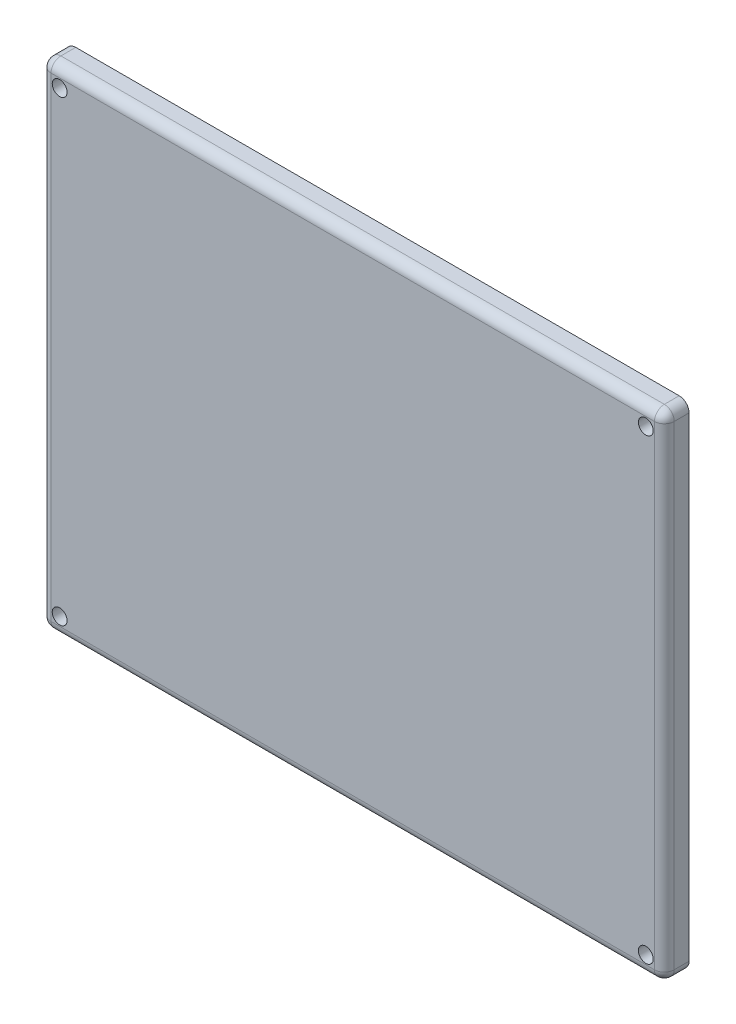
ISO-10303-21;
HEADER;
FILE_DESCRIPTION(('STEP AP214'),'2;1');
FILE_NAME('part.step','',(''),(''),'','','');
FILE_SCHEMA(('AUTOMOTIVE_DESIGN { 1 0 10303 214 1 1 1 1 }'));
ENDSEC;
DATA;
#1=APPLICATION_CONTEXT('core data for automotive mechanical design processes');
#2=APPLICATION_PROTOCOL_DEFINITION('international standard','automotive_design',2000,#1);
#3=PRODUCT_CONTEXT('',#1,'mechanical');
#4=PRODUCT('Part','Part','',(#3));
#5=PRODUCT_RELATED_PRODUCT_CATEGORY('part','',(#4));
#6=PRODUCT_DEFINITION_FORMATION('','',#4);
#7=PRODUCT_DEFINITION_CONTEXT('part definition',#1,'design');
#8=PRODUCT_DEFINITION('design','',#6,#7);
#9=PRODUCT_DEFINITION_SHAPE('','',#8);
#10=(LENGTH_UNIT() NAMED_UNIT(*) SI_UNIT(.MILLI.,.METRE.));
#11=(NAMED_UNIT(*) PLANE_ANGLE_UNIT() SI_UNIT($,.RADIAN.));
#12=(NAMED_UNIT(*) SI_UNIT($,.STERADIAN.) SOLID_ANGLE_UNIT());
#13=UNCERTAINTY_MEASURE_WITH_UNIT(LENGTH_MEASURE(1.E-05),#10,'distance_accuracy_value','');
#14=(GEOMETRIC_REPRESENTATION_CONTEXT(3) GLOBAL_UNCERTAINTY_ASSIGNED_CONTEXT((#13)) GLOBAL_UNIT_ASSIGNED_CONTEXT((#10,
#11,#12)) REPRESENTATION_CONTEXT('',''));
#15=CARTESIAN_POINT('',(0.,0.,0.));
#16=DIRECTION('',(0.,0.,1.));
#17=DIRECTION('',(1.,0.,0.));
#18=AXIS2_PLACEMENT_3D('',#15,#16,#17);
#19=CARTESIAN_POINT('',(0.,0.,6.35));
#20=DIRECTION('',(1.,0.,0.));
#21=DIRECTION('',(0.,1.,0.));
#22=AXIS2_PLACEMENT_3D('',#19,#20,#21);
#23=PLANE('',#22);
#24=DIRECTION('',(0.,-1.,0.));
#25=VECTOR('',#24,1.);
#26=CARTESIAN_POINT('',(0.,0.,0.));
#27=LINE('',#26,#25);
#28=CARTESIAN_POINT('',(0.,-2.54,0.));
#29=VERTEX_POINT('',#28);
#30=CARTESIAN_POINT('',(0.,-124.46,0.));
#31=VERTEX_POINT('',#30);
#32=EDGE_CURVE('E294',#29,#31,#27,.T.);
#33=ORIENTED_EDGE('',*,*,#32,.T.);
#34=DIRECTION('',(0.,0.,-1.));
#35=VECTOR('',#34,1.);
#36=CARTESIAN_POINT('',(0.,-124.46,6.35));
#37=LINE('',#36,#35);
#38=CARTESIAN_POINT('',(0.,-124.46,3.81));
#39=VERTEX_POINT('',#38);
#40=EDGE_CURVE('E245',#31,#39,#37,.F.);
#41=ORIENTED_EDGE('',*,*,#40,.T.);
#42=DIRECTION('',(0.,-1.,0.));
#43=VECTOR('',#42,1.);
#44=CARTESIAN_POINT('',(0.,0.,3.81));
#45=LINE('',#44,#43);
#46=CARTESIAN_POINT('',(0.,-2.54,3.81));
#47=VERTEX_POINT('',#46);
#48=EDGE_CURVE('E242',#39,#47,#45,.F.);
#49=ORIENTED_EDGE('',*,*,#48,.T.);
#50=DIRECTION('',(0.,0.,-1.));
#51=VECTOR('',#50,1.);
#52=CARTESIAN_POINT('',(0.,-2.54,6.35));
#53=LINE('',#52,#51);
#54=EDGE_CURVE('E239',#47,#29,#53,.T.);
#55=ORIENTED_EDGE('',*,*,#54,.T.);
#56=EDGE_LOOP('',(#33,#41,#49,#55));
#57=FACE_BOUND('',#56,.T.);
#58=ADVANCED_FACE('F41',(#57),#23,.F.);
#59=CARTESIAN_POINT('',(0.,-127.,6.35));
#60=DIRECTION('',(0.,1.,0.));
#61=DIRECTION('',(0.,0.,1.));
#62=AXIS2_PLACEMENT_3D('',#59,#60,#61);
#63=PLANE('',#62);
#64=DIRECTION('',(1.,0.,0.));
#65=VECTOR('',#64,1.);
#66=CARTESIAN_POINT('',(0.,-127.,3.81));
#67=LINE('',#66,#65);
#68=CARTESIAN_POINT('',(157.48,-127.,3.81));
#69=VERTEX_POINT('',#68);
#70=CARTESIAN_POINT('',(2.54000000000002,-127.,3.81));
#71=VERTEX_POINT('',#70);
#72=EDGE_CURVE('E233',#69,#71,#67,.F.);
#73=ORIENTED_EDGE('',*,*,#72,.T.);
#74=DIRECTION('',(0.,0.,-1.));
#75=VECTOR('',#74,1.);
#76=CARTESIAN_POINT('',(2.54000000000002,-127.,6.35));
#77=LINE('',#76,#75);
#78=CARTESIAN_POINT('',(2.54000000000002,-127.,0.));
#79=VERTEX_POINT('',#78);
#80=EDGE_CURVE('E236',#71,#79,#77,.T.);
#81=ORIENTED_EDGE('',*,*,#80,.T.);
#82=DIRECTION('',(1.,0.,0.));
#83=VECTOR('',#82,1.);
#84=CARTESIAN_POINT('',(0.,-127.,0.));
#85=LINE('',#84,#83);
#86=CARTESIAN_POINT('',(157.48,-127.,0.));
#87=VERTEX_POINT('',#86);
#88=EDGE_CURVE('E387',#79,#87,#85,.T.);
#89=ORIENTED_EDGE('',*,*,#88,.T.);
#90=DIRECTION('',(0.,0.,-1.));
#91=VECTOR('',#90,1.);
#92=CARTESIAN_POINT('',(157.48,-127.,6.35));
#93=LINE('',#92,#91);
#94=EDGE_CURVE('E230',#87,#69,#93,.F.);
#95=ORIENTED_EDGE('',*,*,#94,.T.);
#96=EDGE_LOOP('',(#73,#81,#89,#95));
#97=FACE_BOUND('',#96,.T.);
#98=ADVANCED_FACE('F447',(#97),#63,.F.);
#99=CARTESIAN_POINT('',(160.02,0.,6.35));
#100=DIRECTION('',(-1.,0.,0.));
#101=DIRECTION('',(0.,-1.,0.));
#102=AXIS2_PLACEMENT_3D('',#99,#100,#101);
#103=PLANE('',#102);
#104=DIRECTION('',(0.,1.,0.));
#105=VECTOR('',#104,1.);
#106=CARTESIAN_POINT('',(160.02,-127.,3.81));
#107=LINE('',#106,#105);
#108=CARTESIAN_POINT('',(160.02,-2.54,3.81));
#109=VERTEX_POINT('',#108);
#110=CARTESIAN_POINT('',(160.02,-124.46,3.81));
#111=VERTEX_POINT('',#110);
#112=EDGE_CURVE('E224',#109,#111,#107,.F.);
#113=ORIENTED_EDGE('',*,*,#112,.T.);
#114=DIRECTION('',(0.,0.,-1.));
#115=VECTOR('',#114,1.);
#116=CARTESIAN_POINT('',(160.02,-124.46,6.35));
#117=LINE('',#116,#115);
#118=CARTESIAN_POINT('',(160.02,-124.46,0.));
#119=VERTEX_POINT('',#118);
#120=EDGE_CURVE('E227',#111,#119,#117,.T.);
#121=ORIENTED_EDGE('',*,*,#120,.T.);
#122=DIRECTION('',(0.,1.,0.));
#123=VECTOR('',#122,1.);
#124=CARTESIAN_POINT('',(160.02,0.,0.));
#125=LINE('',#124,#123);
#126=CARTESIAN_POINT('',(160.02,-2.54,0.));
#127=VERTEX_POINT('',#126);
#128=EDGE_CURVE('E391',#119,#127,#125,.T.);
#129=ORIENTED_EDGE('',*,*,#128,.T.);
#130=DIRECTION('',(0.,0.,-1.));
#131=VECTOR('',#130,1.);
#132=CARTESIAN_POINT('',(160.02,-2.54,6.35));
#133=LINE('',#132,#131);
#134=EDGE_CURVE('E221',#127,#109,#133,.F.);
#135=ORIENTED_EDGE('',*,*,#134,.T.);
#136=EDGE_LOOP('',(#113,#121,#129,#135));
#137=FACE_BOUND('',#136,.T.);
#138=ADVANCED_FACE('F452',(#137),#103,.F.);
#139=CARTESIAN_POINT('',(0.,0.,6.35));
#140=DIRECTION('',(0.,-1.,0.));
#141=DIRECTION('',(0.,0.,-1.));
#142=AXIS2_PLACEMENT_3D('',#139,#140,#141);
#143=PLANE('',#142);
#144=DIRECTION('',(-1.,0.,0.));
#145=VECTOR('',#144,1.);
#146=CARTESIAN_POINT('',(0.,0.,0.));
#147=LINE('',#146,#145);
#148=CARTESIAN_POINT('',(157.48,0.,0.));
#149=VERTEX_POINT('',#148);
#150=CARTESIAN_POINT('',(2.54,0.,0.));
#151=VERTEX_POINT('',#150);
#152=EDGE_CURVE('E201',#149,#151,#147,.T.);
#153=ORIENTED_EDGE('',*,*,#152,.T.);
#154=DIRECTION('',(0.,0.,-1.));
#155=VECTOR('',#154,1.);
#156=CARTESIAN_POINT('',(2.54,0.,6.35));
#157=LINE('',#156,#155);
#158=CARTESIAN_POINT('',(2.54,0.,3.81));
#159=VERTEX_POINT('',#158);
#160=EDGE_CURVE('E218',#151,#159,#157,.F.);
#161=ORIENTED_EDGE('',*,*,#160,.T.);
#162=DIRECTION('',(-1.,0.,0.));
#163=VECTOR('',#162,1.);
#164=CARTESIAN_POINT('',(160.02,0.,3.81));
#165=LINE('',#164,#163);
#166=CARTESIAN_POINT('',(157.48,0.,3.81));
#167=VERTEX_POINT('',#166);
#168=EDGE_CURVE('E174',#159,#167,#165,.F.);
#169=ORIENTED_EDGE('',*,*,#168,.T.);
#170=DIRECTION('',(0.,0.,-1.));
#171=VECTOR('',#170,1.);
#172=CARTESIAN_POINT('',(157.48,0.,6.35));
#173=LINE('',#172,#171);
#174=EDGE_CURVE('E208',#167,#149,#173,.T.);
#175=ORIENTED_EDGE('',*,*,#174,.T.);
#176=EDGE_LOOP('',(#153,#161,#169,#175));
#177=FACE_BOUND('',#176,.T.);
#178=ADVANCED_FACE('F421',(#177),#143,.F.);
#179=CARTESIAN_POINT('',(0.,0.,6.35));
#180=DIRECTION('',(0.,0.,1.));
#181=DIRECTION('',(1.,0.,0.));
#182=AXIS2_PLACEMENT_3D('',#179,#180,#181);
#183=PLANE('',#182);
#184=CARTESIAN_POINT('',(155.2575,-4.7625,6.35));
#185=DIRECTION('',(0.,0.,1.));
#186=DIRECTION('',(1.,0.,0.));
#187=AXIS2_PLACEMENT_3D('',#184,#185,#186);
#188=CIRCLE('',#187,1.90499999999999);
#189=CARTESIAN_POINT('',(157.1625,-4.7625,6.35));
#190=VERTEX_POINT('',#189);
#191=EDGE_CURVE('E716',#190,#190,#188,.F.);
#192=ORIENTED_EDGE('',*,*,#191,.T.);
#193=EDGE_LOOP('',(#192));
#194=FACE_BOUND('',#193,.T.);
#195=CARTESIAN_POINT('',(4.7625,-4.7625,6.35));
#196=DIRECTION('',(0.,0.,1.));
#197=DIRECTION('',(1.,0.,0.));
#198=AXIS2_PLACEMENT_3D('',#195,#196,#197);
#199=CIRCLE('',#198,1.905);
#200=CARTESIAN_POINT('',(6.6675,-4.7625,6.35));
#201=VERTEX_POINT('',#200);
#202=EDGE_CURVE('E720',#201,#201,#199,.F.);
#203=ORIENTED_EDGE('',*,*,#202,.T.);
#204=EDGE_LOOP('',(#203));
#205=FACE_BOUND('',#204,.T.);
#206=CARTESIAN_POINT('',(4.7625,-122.2375,6.35));
#207=DIRECTION('',(0.,0.,1.));
#208=DIRECTION('',(1.,0.,0.));
#209=AXIS2_PLACEMENT_3D('',#206,#207,#208);
#210=CIRCLE('',#209,1.905);
#211=CARTESIAN_POINT('',(6.6675,-122.2375,6.35));
#212=VERTEX_POINT('',#211);
#213=EDGE_CURVE('E724',#212,#212,#210,.F.);
#214=ORIENTED_EDGE('',*,*,#213,.T.);
#215=EDGE_LOOP('',(#214));
#216=FACE_BOUND('',#215,.T.);
#217=CARTESIAN_POINT('',(155.2575,-122.2375,6.35));
#218=DIRECTION('',(0.,0.,1.));
#219=DIRECTION('',(1.,0.,0.));
#220=AXIS2_PLACEMENT_3D('',#217,#218,#219);
#221=CIRCLE('',#220,1.90499999999999);
#222=CARTESIAN_POINT('',(157.1625,-122.2375,6.35));
#223=VERTEX_POINT('',#222);
#224=EDGE_CURVE('E352',#223,#223,#221,.F.);
#225=ORIENTED_EDGE('',*,*,#224,.T.);
#226=EDGE_LOOP('',(#225));
#227=FACE_BOUND('',#226,.T.);
#228=DIRECTION('',(0.,1.,0.));
#229=VECTOR('',#228,1.);
#230=CARTESIAN_POINT('',(157.48,0.,6.35));
#231=LINE('',#230,#229);
#232=CARTESIAN_POINT('',(157.48,-124.46,6.35));
#233=VERTEX_POINT('',#232);
#234=CARTESIAN_POINT('',(157.48,-2.54,6.35));
#235=VERTEX_POINT('',#234);
#236=EDGE_CURVE('E205',#233,#235,#231,.T.);
#237=ORIENTED_EDGE('',*,*,#236,.T.);
#238=DIRECTION('',(-1.,0.,0.));
#239=VECTOR('',#238,1.);
#240=CARTESIAN_POINT('',(0.,-2.54,6.35));
#241=LINE('',#240,#239);
#242=CARTESIAN_POINT('',(2.54,-2.54,6.35));
#243=VERTEX_POINT('',#242);
#244=EDGE_CURVE('E172',#235,#243,#241,.T.);
#245=ORIENTED_EDGE('',*,*,#244,.T.);
#246=DIRECTION('',(0.,-1.,0.));
#247=VECTOR('',#246,1.);
#248=CARTESIAN_POINT('',(2.54000000000002,-127.,6.35));
#249=LINE('',#248,#247);
#250=CARTESIAN_POINT('',(2.54000000000002,-124.46,6.35));
#251=VERTEX_POINT('',#250);
#252=EDGE_CURVE('E193',#243,#251,#249,.T.);
#253=ORIENTED_EDGE('',*,*,#252,.T.);
#254=DIRECTION('',(1.,0.,0.));
#255=VECTOR('',#254,1.);
#256=CARTESIAN_POINT('',(160.02,-124.46,6.35));
#257=LINE('',#256,#255);
#258=EDGE_CURVE('E200',#251,#233,#257,.T.);
#259=ORIENTED_EDGE('',*,*,#258,.T.);
#260=EDGE_LOOP('',(#237,#245,#253,#259));
#261=FACE_BOUND('',#260,.T.);
#262=ADVANCED_FACE('F203',(#194,#205,#216,#227,#261),#183,.T.);
#263=CARTESIAN_POINT('',(0.,0.,0.));
#264=DIRECTION('',(0.,0.,1.));
#265=DIRECTION('',(1.,0.,0.));
#266=AXIS2_PLACEMENT_3D('',#263,#264,#265);
#267=PLANE('',#266);
#268=CARTESIAN_POINT('',(155.2575,-4.7625,0.));
#269=DIRECTION('',(0.,0.,-1.));
#270=DIRECTION('',(-1.,0.,0.));
#271=AXIS2_PLACEMENT_3D('',#268,#269,#270);
#272=CIRCLE('',#271,1.90499999999999);
#273=CARTESIAN_POINT('',(153.3525,-4.7625,0.));
#274=VERTEX_POINT('',#273);
#275=EDGE_CURVE('E760',#274,#274,#272,.T.);
#276=ORIENTED_EDGE('',*,*,#275,.F.);
#277=EDGE_LOOP('',(#276));
#278=FACE_BOUND('',#277,.T.);
#279=CARTESIAN_POINT('',(4.7625,-4.7625,0.));
#280=DIRECTION('',(0.,0.,-1.));
#281=DIRECTION('',(-1.,0.,0.));
#282=AXIS2_PLACEMENT_3D('',#279,#280,#281);
#283=CIRCLE('',#282,1.905);
#284=CARTESIAN_POINT('',(2.8575,-4.7625,0.));
#285=VERTEX_POINT('',#284);
#286=EDGE_CURVE('E754',#285,#285,#283,.T.);
#287=ORIENTED_EDGE('',*,*,#286,.F.);
#288=EDGE_LOOP('',(#287));
#289=FACE_BOUND('',#288,.T.);
#290=CARTESIAN_POINT('',(4.7625,-122.2375,0.));
#291=DIRECTION('',(0.,0.,-1.));
#292=DIRECTION('',(-1.,0.,0.));
#293=AXIS2_PLACEMENT_3D('',#290,#291,#292);
#294=CIRCLE('',#293,1.905);
#295=CARTESIAN_POINT('',(2.8575,-122.2375,0.));
#296=VERTEX_POINT('',#295);
#297=EDGE_CURVE('E748',#296,#296,#294,.T.);
#298=ORIENTED_EDGE('',*,*,#297,.F.);
#299=EDGE_LOOP('',(#298));
#300=FACE_BOUND('',#299,.T.);
#301=CARTESIAN_POINT('',(155.2575,-122.2375,0.));
#302=DIRECTION('',(0.,0.,-1.));
#303=DIRECTION('',(-1.,0.,0.));
#304=AXIS2_PLACEMENT_3D('',#301,#302,#303);
#305=CIRCLE('',#304,1.90499999999999);
#306=CARTESIAN_POINT('',(153.3525,-122.2375,0.));
#307=VERTEX_POINT('',#306);
#308=EDGE_CURVE('E728',#307,#307,#305,.T.);
#309=ORIENTED_EDGE('',*,*,#308,.F.);
#310=EDGE_LOOP('',(#309));
#311=FACE_BOUND('',#310,.T.);
#312=DIRECTION('',(-1.,0.,0.));
#313=VECTOR('',#312,1.);
#314=CARTESIAN_POINT('',(0.,-2.54,0.));
#315=LINE('',#314,#313);
#316=CARTESIAN_POINT('',(147.32,-2.54,0.));
#317=VERTEX_POINT('',#316);
#318=CARTESIAN_POINT('',(12.7000000000001,-2.54,0.));
#319=VERTEX_POINT('',#318);
#320=EDGE_CURVE('E344',#317,#319,#315,.T.);
#321=ORIENTED_EDGE('',*,*,#320,.T.);
#322=DIRECTION('',(0.707106781186551,0.707106781186544,0.));
#323=VECTOR('',#322,1.);
#324=CARTESIAN_POINT('',(7.61999999999998,-7.62000000000006,0.));
#325=LINE('',#324,#323);
#326=CARTESIAN_POINT('',(2.54,-12.7,0.));
#327=VERTEX_POINT('',#326);
#328=EDGE_CURVE('E51',#319,#327,#325,.F.);
#329=ORIENTED_EDGE('',*,*,#328,.T.);
#330=DIRECTION('',(0.,-1.,0.));
#331=VECTOR('',#330,1.);
#332=CARTESIAN_POINT('',(2.54,0.,0.));
#333=LINE('',#332,#331);
#334=CARTESIAN_POINT('',(2.54000000000001,-114.3,0.));
#335=VERTEX_POINT('',#334);
#336=EDGE_CURVE('E343',#327,#335,#333,.T.);
#337=ORIENTED_EDGE('',*,*,#336,.T.);
#338=DIRECTION('',(-0.707106781186544,0.707106781186551,0.));
#339=VECTOR('',#338,1.);
#340=CARTESIAN_POINT('',(-55.8799999999999,-55.8799999999993,0.));
#341=LINE('',#340,#339);
#342=CARTESIAN_POINT('',(12.7,-124.46,0.));
#343=VERTEX_POINT('',#342);
#344=EDGE_CURVE('E336',#335,#343,#341,.F.);
#345=ORIENTED_EDGE('',*,*,#344,.T.);
#346=DIRECTION('',(1.,0.,0.));
#347=VECTOR('',#346,1.);
#348=CARTESIAN_POINT('',(0.,-124.46,0.));
#349=LINE('',#348,#347);
#350=CARTESIAN_POINT('',(147.32,-124.46,0.));
#351=VERTEX_POINT('',#350);
#352=EDGE_CURVE('E351',#343,#351,#349,.T.);
#353=ORIENTED_EDGE('',*,*,#352,.T.);
#354=DIRECTION('',(-0.70710678118655,-0.707106781186545,0.));
#355=VECTOR('',#354,1.);
#356=CARTESIAN_POINT('',(135.889999999999,-135.89,0.));
#357=LINE('',#356,#355);
#358=CARTESIAN_POINT('',(157.48,-114.3,0.));
#359=VERTEX_POINT('',#358);
#360=EDGE_CURVE('E333',#351,#359,#357,.F.);
#361=ORIENTED_EDGE('',*,*,#360,.T.);
#362=DIRECTION('',(0.,1.,0.));
#363=VECTOR('',#362,1.);
#364=CARTESIAN_POINT('',(157.48,0.,0.));
#365=LINE('',#364,#363);
#366=CARTESIAN_POINT('',(157.48,-12.7000000000001,0.));
#367=VERTEX_POINT('',#366);
#368=EDGE_CURVE('E378',#359,#367,#365,.T.);
#369=ORIENTED_EDGE('',*,*,#368,.T.);
#370=DIRECTION('',(0.707106781186544,-0.707106781186551,0.));
#371=VECTOR('',#370,1.);
#372=CARTESIAN_POINT('',(72.3900000000008,72.39,0.));
#373=LINE('',#372,#371);
#374=EDGE_CURVE('E11',#367,#317,#373,.F.);
#375=ORIENTED_EDGE('',*,*,#374,.T.);
#376=EDGE_LOOP('',(#321,#329,#337,#345,#353,#361,#369,#375));
#377=FACE_BOUND('',#376,.T.);
#378=ORIENTED_EDGE('',*,*,#88,.F.);
#379=CARTESIAN_POINT('',(2.54000000000002,-124.46,0.));
#380=DIRECTION('',(0.,0.,1.));
#381=DIRECTION('',(1.,0.,0.));
#382=AXIS2_PLACEMENT_3D('',#379,#380,#381);
#383=CIRCLE('',#382,2.54);
#384=EDGE_CURVE('E257',#79,#31,#383,.F.);
#385=ORIENTED_EDGE('',*,*,#384,.T.);
#386=ORIENTED_EDGE('',*,*,#32,.F.);
#387=CARTESIAN_POINT('',(2.54,-2.54,0.));
#388=DIRECTION('',(0.,0.,1.));
#389=DIRECTION('',(1.,0.,0.));
#390=AXIS2_PLACEMENT_3D('',#387,#388,#389);
#391=CIRCLE('',#390,2.54);
#392=EDGE_CURVE('E251',#29,#151,#391,.F.);
#393=ORIENTED_EDGE('',*,*,#392,.T.);
#394=ORIENTED_EDGE('',*,*,#152,.F.);
#395=CARTESIAN_POINT('',(157.48,-2.54,0.));
#396=DIRECTION('',(0.,0.,1.));
#397=DIRECTION('',(1.,0.,0.));
#398=AXIS2_PLACEMENT_3D('',#395,#396,#397);
#399=CIRCLE('',#398,2.54);
#400=EDGE_CURVE('E248',#149,#127,#399,.F.);
#401=ORIENTED_EDGE('',*,*,#400,.T.);
#402=ORIENTED_EDGE('',*,*,#128,.F.);
#403=CARTESIAN_POINT('',(157.48,-124.46,0.));
#404=DIRECTION('',(0.,0.,1.));
#405=DIRECTION('',(1.,0.,0.));
#406=AXIS2_PLACEMENT_3D('',#403,#404,#405);
#407=CIRCLE('',#406,2.54);
#408=EDGE_CURVE('E254',#119,#87,#407,.F.);
#409=ORIENTED_EDGE('',*,*,#408,.T.);
#410=EDGE_LOOP('',(#378,#385,#386,#393,#394,#401,#402,#409));
#411=FACE_BOUND('',#410,.T.);
#412=ADVANCED_FACE('F341',(#278,#289,#300,#311,#377,#411),#267,.F.);
#413=CARTESIAN_POINT('',(157.48,-124.46,6.35));
#414=DIRECTION('',(0.,0.,-1.));
#415=DIRECTION('',(-1.,0.,0.));
#416=AXIS2_PLACEMENT_3D('',#413,#414,#415);
#417=CYLINDRICAL_SURFACE('',#416,2.54);
#418=ORIENTED_EDGE('',*,*,#408,.F.);
#419=ORIENTED_EDGE('',*,*,#120,.F.);
#420=CARTESIAN_POINT('',(157.48,-124.46,3.81));
#421=DIRECTION('',(0.,0.,1.));
#422=DIRECTION('',(1.,0.,0.));
#423=AXIS2_PLACEMENT_3D('',#420,#421,#422);
#424=CIRCLE('',#423,2.54);
#425=EDGE_CURVE('E290',#69,#111,#424,.T.);
#426=ORIENTED_EDGE('',*,*,#425,.F.);
#427=ORIENTED_EDGE('',*,*,#94,.F.);
#428=EDGE_LOOP('',(#418,#419,#426,#427));
#429=FACE_BOUND('',#428,.T.);
#430=ADVANCED_FACE('F653',(#429),#417,.T.);
#431=CARTESIAN_POINT('',(0.,-124.46,3.81));
#432=DIRECTION('',(-1.,0.,0.));
#433=DIRECTION('',(0.,0.,1.));
#434=AXIS2_PLACEMENT_3D('',#431,#432,#433);
#435=CYLINDRICAL_SURFACE('',#434,2.54);
#436=CARTESIAN_POINT('',(2.54000000000002,-124.46,3.81));
#437=DIRECTION('',(-1.,0.,0.));
#438=DIRECTION('',(0.,0.,1.));
#439=AXIS2_PLACEMENT_3D('',#436,#437,#438);
#440=CIRCLE('',#439,2.54);
#441=EDGE_CURVE('E282',#71,#251,#440,.T.);
#442=ORIENTED_EDGE('',*,*,#441,.F.);
#443=ORIENTED_EDGE('',*,*,#72,.F.);
#444=CARTESIAN_POINT('',(157.48,-124.46,3.81));
#445=DIRECTION('',(1.,0.,0.));
#446=DIRECTION('',(0.,0.,-1.));
#447=AXIS2_PLACEMENT_3D('',#444,#445,#446);
#448=CIRCLE('',#447,2.54);
#449=EDGE_CURVE('E286',#233,#69,#448,.T.);
#450=ORIENTED_EDGE('',*,*,#449,.F.);
#451=ORIENTED_EDGE('',*,*,#258,.F.);
#452=EDGE_LOOP('',(#442,#443,#450,#451));
#453=FACE_BOUND('',#452,.T.);
#454=ADVANCED_FACE('F403',(#453),#435,.T.);
#455=CARTESIAN_POINT('',(2.54000000000002,-124.46,6.35));
#456=DIRECTION('',(0.,0.,-1.));
#457=DIRECTION('',(-1.,0.,0.));
#458=AXIS2_PLACEMENT_3D('',#455,#456,#457);
#459=CYLINDRICAL_SURFACE('',#458,2.54);
#460=ORIENTED_EDGE('',*,*,#384,.F.);
#461=ORIENTED_EDGE('',*,*,#80,.F.);
#462=CARTESIAN_POINT('',(2.54000000000002,-124.46,3.81));
#463=DIRECTION('',(0.,0.,1.));
#464=DIRECTION('',(1.,0.,0.));
#465=AXIS2_PLACEMENT_3D('',#462,#463,#464);
#466=CIRCLE('',#465,2.54);
#467=EDGE_CURVE('E278',#39,#71,#466,.T.);
#468=ORIENTED_EDGE('',*,*,#467,.F.);
#469=ORIENTED_EDGE('',*,*,#40,.F.);
#470=EDGE_LOOP('',(#460,#461,#468,#469));
#471=FACE_BOUND('',#470,.T.);
#472=ADVANCED_FACE('F434',(#471),#459,.T.);
#473=CARTESIAN_POINT('',(157.48,-124.46,3.81));
#474=DIRECTION('',(0.,-1.,0.));
#475=DIRECTION('',(0.,0.,-1.));
#476=AXIS2_PLACEMENT_3D('',#473,#474,#475);
#477=SPHERICAL_SURFACE('',#476,2.54);
#478=ORIENTED_EDGE('',*,*,#449,.T.);
#479=ORIENTED_EDGE('',*,*,#425,.T.);
#480=CARTESIAN_POINT('',(157.48,-124.46,3.81));
#481=DIRECTION('',(0.,-1.,0.));
#482=DIRECTION('',(0.,0.,-1.));
#483=AXIS2_PLACEMENT_3D('',#480,#481,#482);
#484=CIRCLE('',#483,2.54);
#485=EDGE_CURVE('E274',#233,#111,#484,.F.);
#486=ORIENTED_EDGE('',*,*,#485,.F.);
#487=EDGE_LOOP('',(#478,#479,#486));
#488=FACE_BOUND('',#487,.T.);
#489=ADVANCED_FACE('F406',(#488),#477,.T.);
#490=CARTESIAN_POINT('',(2.54000000000002,-124.46,3.81));
#491=DIRECTION('',(0.,-1.,0.));
#492=DIRECTION('',(0.,0.,-1.));
#493=AXIS2_PLACEMENT_3D('',#490,#491,#492);
#494=SPHERICAL_SURFACE('',#493,2.54);
#495=ORIENTED_EDGE('',*,*,#467,.T.);
#496=ORIENTED_EDGE('',*,*,#441,.T.);
#497=CARTESIAN_POINT('',(2.54000000000002,-124.46,3.81));
#498=DIRECTION('',(0.,-1.,0.));
#499=DIRECTION('',(0.,0.,-1.));
#500=AXIS2_PLACEMENT_3D('',#497,#498,#499);
#501=CIRCLE('',#500,2.54);
#502=EDGE_CURVE('E196',#39,#251,#501,.F.);
#503=ORIENTED_EDGE('',*,*,#502,.F.);
#504=EDGE_LOOP('',(#495,#496,#503));
#505=FACE_BOUND('',#504,.T.);
#506=ADVANCED_FACE('F437',(#505),#494,.T.);
#507=CARTESIAN_POINT('',(157.48,-2.54,6.35));
#508=DIRECTION('',(0.,0.,-1.));
#509=DIRECTION('',(-1.,0.,0.));
#510=AXIS2_PLACEMENT_3D('',#507,#508,#509);
#511=CYLINDRICAL_SURFACE('',#510,2.54);
#512=ORIENTED_EDGE('',*,*,#400,.F.);
#513=ORIENTED_EDGE('',*,*,#174,.F.);
#514=CARTESIAN_POINT('',(157.48,-2.54,3.81));
#515=DIRECTION('',(0.,0.,1.));
#516=DIRECTION('',(1.,0.,0.));
#517=AXIS2_PLACEMENT_3D('',#514,#515,#516);
#518=CIRCLE('',#517,2.54);
#519=EDGE_CURVE('E268',#109,#167,#518,.T.);
#520=ORIENTED_EDGE('',*,*,#519,.F.);
#521=ORIENTED_EDGE('',*,*,#134,.F.);
#522=EDGE_LOOP('',(#512,#513,#520,#521));
#523=FACE_BOUND('',#522,.T.);
#524=ADVANCED_FACE('F418',(#523),#511,.T.);
#525=CARTESIAN_POINT('',(157.48,0.,3.81));
#526=DIRECTION('',(0.,-1.,0.));
#527=DIRECTION('',(1.,0.,0.));
#528=AXIS2_PLACEMENT_3D('',#525,#526,#527);
#529=CYLINDRICAL_SURFACE('',#528,2.54);
#530=ORIENTED_EDGE('',*,*,#485,.T.);
#531=ORIENTED_EDGE('',*,*,#112,.F.);
#532=CARTESIAN_POINT('',(157.48,-2.54,3.81));
#533=DIRECTION('',(0.,1.,0.));
#534=DIRECTION('',(-1.,0.,0.));
#535=AXIS2_PLACEMENT_3D('',#532,#533,#534);
#536=CIRCLE('',#535,2.54);
#537=EDGE_CURVE('E190',#235,#109,#536,.T.);
#538=ORIENTED_EDGE('',*,*,#537,.F.);
#539=ORIENTED_EDGE('',*,*,#236,.F.);
#540=EDGE_LOOP('',(#530,#531,#538,#539));
#541=FACE_BOUND('',#540,.T.);
#542=ADVANCED_FACE('F409',(#541),#529,.T.);
#543=CARTESIAN_POINT('',(2.54,0.,3.81));
#544=DIRECTION('',(0.,1.,0.));
#545=DIRECTION('',(-1.,0.,0.));
#546=AXIS2_PLACEMENT_3D('',#543,#544,#545);
#547=CYLINDRICAL_SURFACE('',#546,2.54);
#548=ORIENTED_EDGE('',*,*,#502,.T.);
#549=ORIENTED_EDGE('',*,*,#252,.F.);
#550=CARTESIAN_POINT('',(2.54,-2.54,3.81));
#551=DIRECTION('',(0.,1.,0.));
#552=DIRECTION('',(-1.,0.,0.));
#553=AXIS2_PLACEMENT_3D('',#550,#551,#552);
#554=CIRCLE('',#553,2.54);
#555=EDGE_CURVE('E182',#47,#243,#554,.T.);
#556=ORIENTED_EDGE('',*,*,#555,.F.);
#557=ORIENTED_EDGE('',*,*,#48,.F.);
#558=EDGE_LOOP('',(#548,#549,#556,#557));
#559=FACE_BOUND('',#558,.T.);
#560=ADVANCED_FACE('F194',(#559),#547,.T.);
#561=CARTESIAN_POINT('',(2.54,-2.54,6.35));
#562=DIRECTION('',(0.,0.,-1.));
#563=DIRECTION('',(-1.,0.,0.));
#564=AXIS2_PLACEMENT_3D('',#561,#562,#563);
#565=CYLINDRICAL_SURFACE('',#564,2.54);
#566=ORIENTED_EDGE('',*,*,#392,.F.);
#567=ORIENTED_EDGE('',*,*,#54,.F.);
#568=CARTESIAN_POINT('',(2.54,-2.54,3.81));
#569=DIRECTION('',(0.,0.,1.));
#570=DIRECTION('',(1.,0.,0.));
#571=AXIS2_PLACEMENT_3D('',#568,#569,#570);
#572=CIRCLE('',#571,2.54);
#573=EDGE_CURVE('E186',#159,#47,#572,.T.);
#574=ORIENTED_EDGE('',*,*,#573,.F.);
#575=ORIENTED_EDGE('',*,*,#160,.F.);
#576=EDGE_LOOP('',(#566,#567,#574,#575));
#577=FACE_BOUND('',#576,.T.);
#578=ADVANCED_FACE('F426',(#577),#565,.T.);
#579=CARTESIAN_POINT('',(157.48,-2.54,3.81));
#580=DIRECTION('',(1.,0.,0.));
#581=DIRECTION('',(0.,1.,0.));
#582=AXIS2_PLACEMENT_3D('',#579,#580,#581);
#583=SPHERICAL_SURFACE('',#582,2.54);
#584=ORIENTED_EDGE('',*,*,#537,.T.);
#585=ORIENTED_EDGE('',*,*,#519,.T.);
#586=CARTESIAN_POINT('',(157.48,-2.54,3.81));
#587=DIRECTION('',(1.,0.,0.));
#588=DIRECTION('',(0.,0.,-1.));
#589=AXIS2_PLACEMENT_3D('',#586,#587,#588);
#590=CIRCLE('',#589,2.54);
#591=EDGE_CURVE('E178',#235,#167,#590,.F.);
#592=ORIENTED_EDGE('',*,*,#591,.F.);
#593=EDGE_LOOP('',(#584,#585,#592));
#594=FACE_BOUND('',#593,.T.);
#595=ADVANCED_FACE('F413',(#594),#583,.T.);
#596=CARTESIAN_POINT('',(2.54,-2.54,3.81));
#597=DIRECTION('',(-1.,0.,0.));
#598=DIRECTION('',(0.,-1.,0.));
#599=AXIS2_PLACEMENT_3D('',#596,#597,#598);
#600=SPHERICAL_SURFACE('',#599,2.54);
#601=ORIENTED_EDGE('',*,*,#573,.T.);
#602=ORIENTED_EDGE('',*,*,#555,.T.);
#603=CARTESIAN_POINT('',(2.54,-2.54,3.81));
#604=DIRECTION('',(-1.,0.,0.));
#605=DIRECTION('',(0.,0.,1.));
#606=AXIS2_PLACEMENT_3D('',#603,#604,#605);
#607=CIRCLE('',#606,2.54);
#608=EDGE_CURVE('E168',#159,#243,#607,.F.);
#609=ORIENTED_EDGE('',*,*,#608,.F.);
#610=EDGE_LOOP('',(#601,#602,#609));
#611=FACE_BOUND('',#610,.T.);
#612=ADVANCED_FACE('F184',(#611),#600,.T.);
#613=CARTESIAN_POINT('',(0.,-2.54,3.81));
#614=DIRECTION('',(1.,0.,0.));
#615=DIRECTION('',(0.,0.,-1.));
#616=AXIS2_PLACEMENT_3D('',#613,#614,#615);
#617=CYLINDRICAL_SURFACE('',#616,2.54);
#618=ORIENTED_EDGE('',*,*,#591,.T.);
#619=ORIENTED_EDGE('',*,*,#168,.F.);
#620=ORIENTED_EDGE('',*,*,#608,.T.);
#621=ORIENTED_EDGE('',*,*,#244,.F.);
#622=EDGE_LOOP('',(#618,#619,#620,#621));
#623=FACE_BOUND('',#622,.T.);
#624=ADVANCED_FACE('F170',(#623),#617,.T.);
#625=CARTESIAN_POINT('',(2.54,0.,6.35));
#626=DIRECTION('',(1.,0.,0.));
#627=DIRECTION('',(0.,1.,0.));
#628=AXIS2_PLACEMENT_3D('',#625,#626,#627);
#629=PLANE('',#628);
#630=DIRECTION('',(0.,-1.,0.));
#631=VECTOR('',#630,1.);
#632=CARTESIAN_POINT('',(2.54,0.,3.81));
#633=LINE('',#632,#631);
#634=CARTESIAN_POINT('',(2.54,-12.7,3.81));
#635=VERTEX_POINT('',#634);
#636=CARTESIAN_POINT('',(2.54000000000001,-114.3,3.81));
#637=VERTEX_POINT('',#636);
#638=EDGE_CURVE('E363',#635,#637,#633,.T.);
#639=ORIENTED_EDGE('',*,*,#638,.T.);
#640=DIRECTION('',(0.,0.,-1.));
#641=VECTOR('',#640,1.);
#642=CARTESIAN_POINT('',(2.54000000000001,-114.3,0.));
#643=LINE('',#642,#641);
#644=EDGE_CURVE('E323',#637,#335,#643,.T.);
#645=ORIENTED_EDGE('',*,*,#644,.T.);
#646=ORIENTED_EDGE('',*,*,#336,.F.);
#647=DIRECTION('',(0.,0.,1.));
#648=VECTOR('',#647,1.);
#649=CARTESIAN_POINT('',(2.54,-12.7,3.81));
#650=LINE('',#649,#648);
#651=EDGE_CURVE('E320',#327,#635,#650,.T.);
#652=ORIENTED_EDGE('',*,*,#651,.T.);
#653=EDGE_LOOP('',(#639,#645,#646,#652));
#654=FACE_BOUND('',#653,.T.);
#655=ADVANCED_FACE('F347',(#654),#629,.T.);
#656=CARTESIAN_POINT('',(0.,-124.46,6.35));
#657=DIRECTION('',(0.,1.,0.));
#658=DIRECTION('',(0.,0.,1.));
#659=AXIS2_PLACEMENT_3D('',#656,#657,#658);
#660=PLANE('',#659);
#661=DIRECTION('',(-1.,0.,0.));
#662=VECTOR('',#661,1.);
#663=CARTESIAN_POINT('',(0.,-124.46,3.81));
#664=LINE('',#663,#662);
#665=CARTESIAN_POINT('',(147.32,-124.46,3.81));
#666=VERTEX_POINT('',#665);
#667=CARTESIAN_POINT('',(12.7,-124.46,3.81));
#668=VERTEX_POINT('',#667);
#669=EDGE_CURVE('E179',#666,#668,#664,.T.);
#670=ORIENTED_EDGE('',*,*,#669,.F.);
#671=DIRECTION('',(0.,0.,-1.));
#672=VECTOR('',#671,1.);
#673=CARTESIAN_POINT('',(147.32,-124.46,0.));
#674=LINE('',#673,#672);
#675=EDGE_CURVE('E297',#666,#351,#674,.T.);
#676=ORIENTED_EDGE('',*,*,#675,.T.);
#677=ORIENTED_EDGE('',*,*,#352,.F.);
#678=DIRECTION('',(0.,0.,1.));
#679=VECTOR('',#678,1.);
#680=CARTESIAN_POINT('',(12.7,-124.46,3.81));
#681=LINE('',#680,#679);
#682=EDGE_CURVE('E259',#343,#668,#681,.T.);
#683=ORIENTED_EDGE('',*,*,#682,.T.);
#684=EDGE_LOOP('',(#670,#676,#677,#683));
#685=FACE_BOUND('',#684,.T.);
#686=ADVANCED_FACE('F498',(#685),#660,.T.);
#687=CARTESIAN_POINT('',(157.48,0.,6.35));
#688=DIRECTION('',(-1.,0.,0.));
#689=DIRECTION('',(0.,-1.,0.));
#690=AXIS2_PLACEMENT_3D('',#687,#688,#689);
#691=PLANE('',#690);
#692=ORIENTED_EDGE('',*,*,#368,.F.);
#693=DIRECTION('',(0.,0.,1.));
#694=VECTOR('',#693,1.);
#695=CARTESIAN_POINT('',(157.48,-114.3,3.81));
#696=LINE('',#695,#694);
#697=CARTESIAN_POINT('',(157.48,-114.3,3.81));
#698=VERTEX_POINT('',#697);
#699=EDGE_CURVE('E305',#359,#698,#696,.T.);
#700=ORIENTED_EDGE('',*,*,#699,.T.);
#701=DIRECTION('',(0.,-1.,0.));
#702=VECTOR('',#701,1.);
#703=CARTESIAN_POINT('',(157.48,0.,3.81));
#704=LINE('',#703,#702);
#705=CARTESIAN_POINT('',(157.48,-12.7000000000001,3.81));
#706=VERTEX_POINT('',#705);
#707=EDGE_CURVE('E368',#706,#698,#704,.T.);
#708=ORIENTED_EDGE('',*,*,#707,.F.);
#709=DIRECTION('',(0.,0.,-1.));
#710=VECTOR('',#709,1.);
#711=CARTESIAN_POINT('',(157.48,-12.7000000000001,0.));
#712=LINE('',#711,#710);
#713=EDGE_CURVE('E301',#706,#367,#712,.T.);
#714=ORIENTED_EDGE('',*,*,#713,.T.);
#715=EDGE_LOOP('',(#692,#700,#708,#714));
#716=FACE_BOUND('',#715,.T.);
#717=ADVANCED_FACE('F505',(#716),#691,.T.);
#718=CARTESIAN_POINT('',(0.,-2.54,6.35));
#719=DIRECTION('',(0.,-1.,0.));
#720=DIRECTION('',(0.,0.,-1.));
#721=AXIS2_PLACEMENT_3D('',#718,#719,#720);
#722=PLANE('',#721);
#723=DIRECTION('',(1.,0.,0.));
#724=VECTOR('',#723,1.);
#725=CARTESIAN_POINT('',(0.,-2.54,3.81));
#726=LINE('',#725,#724);
#727=CARTESIAN_POINT('',(12.7000000000001,-2.54,3.81));
#728=VERTEX_POINT('',#727);
#729=CARTESIAN_POINT('',(147.32,-2.54,3.81));
#730=VERTEX_POINT('',#729);
#731=EDGE_CURVE('E361',#728,#730,#726,.T.);
#732=ORIENTED_EDGE('',*,*,#731,.F.);
#733=DIRECTION('',(0.,0.,-1.));
#734=VECTOR('',#733,1.);
#735=CARTESIAN_POINT('',(12.7000000000001,-2.54,0.));
#736=LINE('',#735,#734);
#737=EDGE_CURVE('E330',#728,#319,#736,.T.);
#738=ORIENTED_EDGE('',*,*,#737,.T.);
#739=ORIENTED_EDGE('',*,*,#320,.F.);
#740=DIRECTION('',(0.,0.,1.));
#741=VECTOR('',#740,1.);
#742=CARTESIAN_POINT('',(147.32,-2.54,3.81));
#743=LINE('',#742,#741);
#744=EDGE_CURVE('E327',#317,#730,#743,.T.);
#745=ORIENTED_EDGE('',*,*,#744,.T.);
#746=EDGE_LOOP('',(#732,#738,#739,#745));
#747=FACE_BOUND('',#746,.T.);
#748=ADVANCED_FACE('F365',(#747),#722,.T.);
#749=CARTESIAN_POINT('',(0.,0.,3.81));
#750=DIRECTION('',(0.,0.,1.));
#751=DIRECTION('',(1.,0.,0.));
#752=AXIS2_PLACEMENT_3D('',#749,#750,#751);
#753=PLANE('',#752);
#754=ORIENTED_EDGE('',*,*,#707,.T.);
#755=DIRECTION('',(0.70710678118655,0.707106781186545,0.));
#756=VECTOR('',#755,1.);
#757=CARTESIAN_POINT('',(147.32,-124.46,3.81));
#758=LINE('',#757,#756);
#759=EDGE_CURVE('E317',#698,#666,#758,.F.);
#760=ORIENTED_EDGE('',*,*,#759,.T.);
#761=ORIENTED_EDGE('',*,*,#669,.T.);
#762=DIRECTION('',(0.707106781186544,-0.707106781186551,0.));
#763=VECTOR('',#762,1.);
#764=CARTESIAN_POINT('',(2.54000000000001,-114.3,3.81));
#765=LINE('',#764,#763);
#766=EDGE_CURVE('E314',#668,#637,#765,.F.);
#767=ORIENTED_EDGE('',*,*,#766,.T.);
#768=ORIENTED_EDGE('',*,*,#638,.F.);
#769=DIRECTION('',(-0.707106781186551,-0.707106781186544,0.));
#770=VECTOR('',#769,1.);
#771=CARTESIAN_POINT('',(12.7000000000001,-2.54,3.81));
#772=LINE('',#771,#770);
#773=EDGE_CURVE('E311',#635,#728,#772,.F.);
#774=ORIENTED_EDGE('',*,*,#773,.T.);
#775=ORIENTED_EDGE('',*,*,#731,.T.);
#776=DIRECTION('',(-0.707106781186544,0.707106781186551,0.));
#777=VECTOR('',#776,1.);
#778=CARTESIAN_POINT('',(157.48,-12.7000000000001,3.81));
#779=LINE('',#778,#777);
#780=EDGE_CURVE('E308',#730,#706,#779,.F.);
#781=ORIENTED_EDGE('',*,*,#780,.T.);
#782=EDGE_LOOP('',(#754,#760,#761,#767,#768,#774,#775,#781));
#783=FACE_BOUND('',#782,.T.);
#784=ADVANCED_FACE('F360',(#783),#753,.F.);
#785=CARTESIAN_POINT('',(147.32,-124.46,6.35));
#786=DIRECTION('',(-0.707106781186545,0.70710678118655,0.));
#787=DIRECTION('',(0.,0.,1.));
#788=AXIS2_PLACEMENT_3D('',#785,#786,#787);
#789=PLANE('',#788);
#790=ORIENTED_EDGE('',*,*,#759,.F.);
#791=ORIENTED_EDGE('',*,*,#699,.F.);
#792=ORIENTED_EDGE('',*,*,#360,.F.);
#793=ORIENTED_EDGE('',*,*,#675,.F.);
#794=EDGE_LOOP('',(#790,#791,#792,#793));
#795=FACE_BOUND('',#794,.T.);
#796=ADVANCED_FACE('F526',(#795),#789,.T.);
#797=CARTESIAN_POINT('',(2.54000000000001,-114.3,6.35));
#798=DIRECTION('',(0.707106781186551,0.707106781186544,0.));
#799=DIRECTION('',(0.,0.,1.));
#800=AXIS2_PLACEMENT_3D('',#797,#798,#799);
#801=PLANE('',#800);
#802=ORIENTED_EDGE('',*,*,#766,.F.);
#803=ORIENTED_EDGE('',*,*,#682,.F.);
#804=ORIENTED_EDGE('',*,*,#344,.F.);
#805=ORIENTED_EDGE('',*,*,#644,.F.);
#806=EDGE_LOOP('',(#802,#803,#804,#805));
#807=FACE_BOUND('',#806,.T.);
#808=ADVANCED_FACE('F533',(#807),#801,.T.);
#809=CARTESIAN_POINT('',(12.7000000000001,-2.54,6.35));
#810=DIRECTION('',(0.707106781186544,-0.707106781186551,0.));
#811=DIRECTION('',(0.,0.,1.));
#812=AXIS2_PLACEMENT_3D('',#809,#810,#811);
#813=PLANE('',#812);
#814=ORIENTED_EDGE('',*,*,#773,.F.);
#815=ORIENTED_EDGE('',*,*,#651,.F.);
#816=ORIENTED_EDGE('',*,*,#328,.F.);
#817=ORIENTED_EDGE('',*,*,#737,.F.);
#818=EDGE_LOOP('',(#814,#815,#816,#817));
#819=FACE_BOUND('',#818,.T.);
#820=ADVANCED_FACE('F355',(#819),#813,.T.);
#821=CARTESIAN_POINT('',(157.48,-12.7000000000001,6.35));
#822=DIRECTION('',(-0.707106781186551,-0.707106781186544,0.));
#823=DIRECTION('',(0.,0.,1.));
#824=AXIS2_PLACEMENT_3D('',#821,#822,#823);
#825=PLANE('',#824);
#826=ORIENTED_EDGE('',*,*,#780,.F.);
#827=ORIENTED_EDGE('',*,*,#744,.F.);
#828=ORIENTED_EDGE('',*,*,#374,.F.);
#829=ORIENTED_EDGE('',*,*,#713,.F.);
#830=EDGE_LOOP('',(#826,#827,#828,#829));
#831=FACE_BOUND('',#830,.T.);
#832=ADVANCED_FACE('F44',(#831),#825,.T.);
#833=CARTESIAN_POINT('',(155.2575,-122.2375,0.));
#834=DIRECTION('',(0.,0.,-1.));
#835=DIRECTION('',(-1.,0.,0.));
#836=AXIS2_PLACEMENT_3D('',#833,#834,#835);
#837=CYLINDRICAL_SURFACE('',#836,1.90499999999999);
#838=ORIENTED_EDGE('',*,*,#224,.F.);
#839=EDGE_LOOP('',(#838));
#840=FACE_BOUND('',#839,.T.);
#841=ORIENTED_EDGE('',*,*,#308,.T.);
#842=EDGE_LOOP('',(#841));
#843=FACE_BOUND('',#842,.T.);
#844=ADVANCED_FACE('F553',(#840,#843),#837,.F.);
#845=CARTESIAN_POINT('',(4.7625,-122.2375,0.));
#846=DIRECTION('',(0.,0.,-1.));
#847=DIRECTION('',(-1.,0.,0.));
#848=AXIS2_PLACEMENT_3D('',#845,#846,#847);
#849=CYLINDRICAL_SURFACE('',#848,1.905);
#850=ORIENTED_EDGE('',*,*,#213,.F.);
#851=EDGE_LOOP('',(#850));
#852=FACE_BOUND('',#851,.T.);
#853=ORIENTED_EDGE('',*,*,#297,.T.);
#854=EDGE_LOOP('',(#853));
#855=FACE_BOUND('',#854,.T.);
#856=ADVANCED_FACE('F561',(#852,#855),#849,.F.);
#857=CARTESIAN_POINT('',(4.7625,-4.7625,0.));
#858=DIRECTION('',(0.,0.,-1.));
#859=DIRECTION('',(-1.,0.,0.));
#860=AXIS2_PLACEMENT_3D('',#857,#858,#859);
#861=CYLINDRICAL_SURFACE('',#860,1.905);
#862=ORIENTED_EDGE('',*,*,#202,.F.);
#863=EDGE_LOOP('',(#862));
#864=FACE_BOUND('',#863,.T.);
#865=ORIENTED_EDGE('',*,*,#286,.T.);
#866=EDGE_LOOP('',(#865));
#867=FACE_BOUND('',#866,.T.);
#868=ADVANCED_FACE('F570',(#864,#867),#861,.F.);
#869=CARTESIAN_POINT('',(155.2575,-4.7625,0.));
#870=DIRECTION('',(0.,0.,-1.));
#871=DIRECTION('',(-1.,0.,0.));
#872=AXIS2_PLACEMENT_3D('',#869,#870,#871);
#873=CYLINDRICAL_SURFACE('',#872,1.90499999999999);
#874=ORIENTED_EDGE('',*,*,#191,.F.);
#875=EDGE_LOOP('',(#874));
#876=FACE_BOUND('',#875,.T.);
#877=ORIENTED_EDGE('',*,*,#275,.T.);
#878=EDGE_LOOP('',(#877));
#879=FACE_BOUND('',#878,.T.);
#880=ADVANCED_FACE('F578',(#876,#879),#873,.F.);
#881=CLOSED_SHELL('',(#58,#98,#138,#178,#262,#412,#430,#454,#472,#489,#506,#524,#542,#560,#578,
#595,#612,#624,#655,#686,#717,#748,#784,#796,#808,#820,#832,#844,#856,#868,#880));
#882=MANIFOLD_SOLID_BREP('B2',#881);
#883=ADVANCED_BREP_SHAPE_REPRESENTATION('',(#18,#882),#14);
#884=SHAPE_DEFINITION_REPRESENTATION(#9,#883);
ENDSEC;
END-ISO-10303-21;
